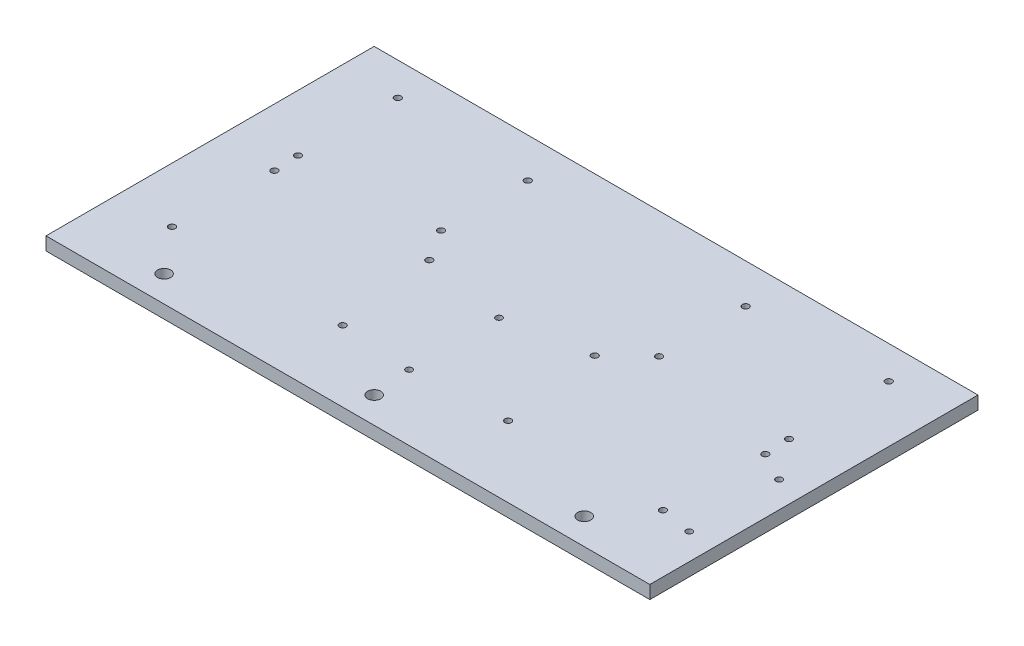
ISO-10303-21;
HEADER;
FILE_DESCRIPTION(('STEP AP214'),'2;1');
FILE_NAME('part.step','',(''),(''),'','','');
FILE_SCHEMA(('AUTOMOTIVE_DESIGN { 1 0 10303 214 1 1 1 1 }'));
ENDSEC;
DATA;
#1=APPLICATION_CONTEXT('core data for automotive mechanical design processes');
#2=APPLICATION_PROTOCOL_DEFINITION('international standard','automotive_design',2000,#1);
#3=PRODUCT_CONTEXT('',#1,'mechanical');
#4=PRODUCT('Part','Part','',(#3));
#5=PRODUCT_RELATED_PRODUCT_CATEGORY('part','',(#4));
#6=PRODUCT_DEFINITION_FORMATION('','',#4);
#7=PRODUCT_DEFINITION_CONTEXT('part definition',#1,'design');
#8=PRODUCT_DEFINITION('design','',#6,#7);
#9=PRODUCT_DEFINITION_SHAPE('','',#8);
#10=(LENGTH_UNIT() NAMED_UNIT(*) SI_UNIT(.MILLI.,.METRE.));
#11=(NAMED_UNIT(*) PLANE_ANGLE_UNIT() SI_UNIT($,.RADIAN.));
#12=(NAMED_UNIT(*) SI_UNIT($,.STERADIAN.) SOLID_ANGLE_UNIT());
#13=UNCERTAINTY_MEASURE_WITH_UNIT(LENGTH_MEASURE(1.E-05),#10,'distance_accuracy_value','');
#14=(GEOMETRIC_REPRESENTATION_CONTEXT(3) GLOBAL_UNCERTAINTY_ASSIGNED_CONTEXT((#13)) GLOBAL_UNIT_ASSIGNED_CONTEXT((#10,
#11,#12)) REPRESENTATION_CONTEXT('',''));
#15=CARTESIAN_POINT('',(0.,0.,0.));
#16=DIRECTION('',(0.,0.,1.));
#17=DIRECTION('',(1.,0.,0.));
#18=AXIS2_PLACEMENT_3D('',#15,#16,#17);
#19=CARTESIAN_POINT('',(0.,6.35,0.));
#20=DIRECTION('',(1.,0.,0.));
#21=DIRECTION('',(0.,0.,-1.));
#22=AXIS2_PLACEMENT_3D('',#19,#20,#21);
#23=PLANE('',#22);
#24=DIRECTION('',(0.,0.,1.));
#25=VECTOR('',#24,1.);
#26=CARTESIAN_POINT('',(0.,0.,0.));
#27=LINE('',#26,#25);
#28=CARTESIAN_POINT('',(0.,0.,-158.75));
#29=VERTEX_POINT('',#28);
#30=CARTESIAN_POINT('',(0.,0.,0.));
#31=VERTEX_POINT('',#30);
#32=EDGE_CURVE('E95',#29,#31,#27,.T.);
#33=ORIENTED_EDGE('',*,*,#32,.T.);
#34=DIRECTION('',(0.,-1.,0.));
#35=VECTOR('',#34,1.);
#36=CARTESIAN_POINT('',(0.,6.35,0.));
#37=LINE('',#36,#35);
#38=CARTESIAN_POINT('',(0.,6.35,0.));
#39=VERTEX_POINT('',#38);
#40=EDGE_CURVE('E11',#39,#31,#37,.T.);
#41=ORIENTED_EDGE('',*,*,#40,.F.);
#42=DIRECTION('',(0.,0.,1.));
#43=VECTOR('',#42,1.);
#44=CARTESIAN_POINT('',(0.,6.35,0.));
#45=LINE('',#44,#43);
#46=CARTESIAN_POINT('',(0.,6.35,-158.75));
#47=VERTEX_POINT('',#46);
#48=EDGE_CURVE('E83',#47,#39,#45,.T.);
#49=ORIENTED_EDGE('',*,*,#48,.F.);
#50=DIRECTION('',(0.,-1.,0.));
#51=VECTOR('',#50,1.);
#52=CARTESIAN_POINT('',(0.,6.35,-158.75));
#53=LINE('',#52,#51);
#54=EDGE_CURVE('E91',#47,#29,#53,.T.);
#55=ORIENTED_EDGE('',*,*,#54,.T.);
#56=EDGE_LOOP('',(#33,#41,#49,#55));
#57=FACE_BOUND('',#56,.T.);
#58=ADVANCED_FACE('F32',(#57),#23,.F.);
#59=CARTESIAN_POINT('',(0.,6.35,0.));
#60=DIRECTION('',(0.,0.,-1.));
#61=DIRECTION('',(-1.,0.,0.));
#62=AXIS2_PLACEMENT_3D('',#59,#60,#61);
#63=PLANE('',#62);
#64=DIRECTION('',(1.,0.,0.));
#65=VECTOR('',#64,1.);
#66=CARTESIAN_POINT('',(0.,0.,0.));
#67=LINE('',#66,#65);
#68=CARTESIAN_POINT('',(292.1,0.,0.));
#69=VERTEX_POINT('',#68);
#70=EDGE_CURVE('E87',#31,#69,#67,.T.);
#71=ORIENTED_EDGE('',*,*,#70,.T.);
#72=DIRECTION('',(0.,-1.,0.));
#73=VECTOR('',#72,1.);
#74=CARTESIAN_POINT('',(292.1,6.35,0.));
#75=LINE('',#74,#73);
#76=CARTESIAN_POINT('',(292.1,6.35,0.));
#77=VERTEX_POINT('',#76);
#78=EDGE_CURVE('E40',#77,#69,#75,.T.);
#79=ORIENTED_EDGE('',*,*,#78,.F.);
#80=DIRECTION('',(1.,0.,0.));
#81=VECTOR('',#80,1.);
#82=CARTESIAN_POINT('',(0.,6.35,0.));
#83=LINE('',#82,#81);
#84=EDGE_CURVE('E78',#39,#77,#83,.T.);
#85=ORIENTED_EDGE('',*,*,#84,.F.);
#86=ORIENTED_EDGE('',*,*,#40,.T.);
#87=EDGE_LOOP('',(#71,#79,#85,#86));
#88=FACE_BOUND('',#87,.T.);
#89=ADVANCED_FACE('F86',(#88),#63,.F.);
#90=CARTESIAN_POINT('',(292.1,6.35,0.));
#91=DIRECTION('',(-1.,0.,0.));
#92=DIRECTION('',(0.,0.,1.));
#93=AXIS2_PLACEMENT_3D('',#90,#91,#92);
#94=PLANE('',#93);
#95=DIRECTION('',(0.,0.,-1.));
#96=VECTOR('',#95,1.);
#97=CARTESIAN_POINT('',(292.1,0.,0.));
#98=LINE('',#97,#96);
#99=CARTESIAN_POINT('',(292.1,0.,-158.75));
#100=VERTEX_POINT('',#99);
#101=EDGE_CURVE('E65',#69,#100,#98,.T.);
#102=ORIENTED_EDGE('',*,*,#101,.T.);
#103=DIRECTION('',(0.,-1.,0.));
#104=VECTOR('',#103,1.);
#105=CARTESIAN_POINT('',(292.1,6.35,-158.75));
#106=LINE('',#105,#104);
#107=CARTESIAN_POINT('',(292.1,6.35,-158.75));
#108=VERTEX_POINT('',#107);
#109=EDGE_CURVE('E88',#108,#100,#106,.T.);
#110=ORIENTED_EDGE('',*,*,#109,.F.);
#111=DIRECTION('',(0.,0.,-1.));
#112=VECTOR('',#111,1.);
#113=CARTESIAN_POINT('',(292.1,6.35,0.));
#114=LINE('',#113,#112);
#115=EDGE_CURVE('E81',#77,#108,#114,.T.);
#116=ORIENTED_EDGE('',*,*,#115,.F.);
#117=ORIENTED_EDGE('',*,*,#78,.T.);
#118=EDGE_LOOP('',(#102,#110,#116,#117));
#119=FACE_BOUND('',#118,.T.);
#120=ADVANCED_FACE('F89',(#119),#94,.F.);
#121=CARTESIAN_POINT('',(0.,6.35,-158.75));
#122=DIRECTION('',(0.,0.,1.));
#123=DIRECTION('',(1.,0.,0.));
#124=AXIS2_PLACEMENT_3D('',#121,#122,#123);
#125=PLANE('',#124);
#126=DIRECTION('',(-1.,0.,0.));
#127=VECTOR('',#126,1.);
#128=CARTESIAN_POINT('',(0.,0.,-158.75));
#129=LINE('',#128,#127);
#130=EDGE_CURVE('E71',#100,#29,#129,.T.);
#131=ORIENTED_EDGE('',*,*,#130,.T.);
#132=ORIENTED_EDGE('',*,*,#54,.F.);
#133=DIRECTION('',(-1.,0.,0.));
#134=VECTOR('',#133,1.);
#135=CARTESIAN_POINT('',(0.,6.35,-158.75));
#136=LINE('',#135,#134);
#137=EDGE_CURVE('E48',#108,#47,#136,.T.);
#138=ORIENTED_EDGE('',*,*,#137,.F.);
#139=ORIENTED_EDGE('',*,*,#109,.T.);
#140=EDGE_LOOP('',(#131,#132,#138,#139));
#141=FACE_BOUND('',#140,.T.);
#142=ADVANCED_FACE('F103',(#141),#125,.F.);
#143=CARTESIAN_POINT('',(0.,6.35,0.));
#144=DIRECTION('',(0.,-1.,0.));
#145=DIRECTION('',(0.,0.,-1.));
#146=AXIS2_PLACEMENT_3D('',#143,#144,#145);
#147=PLANE('',#146);
#148=CARTESIAN_POINT('',(279.4,6.35,-75.25));
#149=DIRECTION('',(0.,1.,0.));
#150=DIRECTION('',(0.,0.,1.));
#151=AXIS2_PLACEMENT_3D('',#148,#149,#150);
#152=CIRCLE('',#151,1.52499999999998);
#153=CARTESIAN_POINT('',(279.4,6.35,-73.725));
#154=VERTEX_POINT('',#153);
#155=EDGE_CURVE('E241',#154,#154,#152,.T.);
#156=ORIENTED_EDGE('',*,*,#155,.F.);
#157=EDGE_LOOP('',(#156));
#158=FACE_BOUND('',#157,.T.);
#159=CARTESIAN_POINT('',(143.9,6.35,-75.25));
#160=DIRECTION('',(0.,1.,0.));
#161=DIRECTION('',(0.,0.,1.));
#162=AXIS2_PLACEMENT_3D('',#159,#160,#161);
#163=CIRCLE('',#162,1.52500000000001);
#164=CARTESIAN_POINT('',(143.9,6.35,-73.725));
#165=VERTEX_POINT('',#164);
#166=EDGE_CURVE('E235',#165,#165,#163,.T.);
#167=ORIENTED_EDGE('',*,*,#166,.F.);
#168=EDGE_LOOP('',(#167));
#169=FACE_BOUND('',#168,.T.);
#170=CARTESIAN_POINT('',(143.9,6.35,-31.75));
#171=DIRECTION('',(0.,1.,0.));
#172=DIRECTION('',(0.,0.,1.));
#173=AXIS2_PLACEMENT_3D('',#170,#171,#172);
#174=CIRCLE('',#173,1.52500000000001);
#175=CARTESIAN_POINT('',(143.9,6.35,-30.225));
#176=VERTEX_POINT('',#175);
#177=EDGE_CURVE('E229',#176,#176,#174,.T.);
#178=ORIENTED_EDGE('',*,*,#177,.F.);
#179=EDGE_LOOP('',(#178));
#180=FACE_BOUND('',#179,.T.);
#181=CARTESIAN_POINT('',(279.4,6.35,-31.75));
#182=DIRECTION('',(0.,1.,0.));
#183=DIRECTION('',(0.,0.,1.));
#184=AXIS2_PLACEMENT_3D('',#181,#182,#183);
#185=CIRCLE('',#184,1.52499999999998);
#186=CARTESIAN_POINT('',(279.4,6.35,-30.225));
#187=VERTEX_POINT('',#186);
#188=EDGE_CURVE('E223',#187,#187,#185,.T.);
#189=ORIENTED_EDGE('',*,*,#188,.F.);
#190=EDGE_LOOP('',(#189));
#191=FACE_BOUND('',#190,.T.);
#192=CARTESIAN_POINT('',(189.23,6.35,-34.29));
#193=DIRECTION('',(0.,1.,0.));
#194=DIRECTION('',(0.,0.,1.));
#195=AXIS2_PLACEMENT_3D('',#192,#193,#194);
#196=CIRCLE('',#195,1.58749999999999);
#197=CARTESIAN_POINT('',(189.23,6.35,-32.7025));
#198=VERTEX_POINT('',#197);
#199=EDGE_CURVE('E218',#198,#198,#196,.T.);
#200=ORIENTED_EDGE('',*,*,#199,.F.);
#201=EDGE_LOOP('',(#200));
#202=FACE_BOUND('',#201,.T.);
#203=CARTESIAN_POINT('',(265.43,6.35,-82.55));
#204=DIRECTION('',(0.,1.,0.));
#205=DIRECTION('',(0.,0.,1.));
#206=AXIS2_PLACEMENT_3D('',#203,#204,#205);
#207=CIRCLE('',#206,1.58750000000004);
#208=CARTESIAN_POINT('',(265.43,6.35,-80.9624999999999));
#209=VERTEX_POINT('',#208);
#210=EDGE_CURVE('E212',#209,#209,#207,.T.);
#211=ORIENTED_EDGE('',*,*,#210,.F.);
#212=EDGE_LOOP('',(#211));
#213=FACE_BOUND('',#212,.T.);
#214=CARTESIAN_POINT('',(264.16,6.35,-34.29));
#215=DIRECTION('',(0.,1.,0.));
#216=DIRECTION('',(0.,0.,1.));
#217=AXIS2_PLACEMENT_3D('',#214,#215,#216);
#218=CIRCLE('',#217,1.58750000000004);
#219=CARTESIAN_POINT('',(264.16,6.35,-32.7025));
#220=VERTEX_POINT('',#219);
#221=EDGE_CURVE('E206',#220,#220,#218,.T.);
#222=ORIENTED_EDGE('',*,*,#221,.F.);
#223=EDGE_LOOP('',(#222));
#224=FACE_BOUND('',#223,.T.);
#225=CARTESIAN_POINT('',(264.795,6.35,-142.875));
#226=DIRECTION('',(0.,1.,0.));
#227=DIRECTION('',(0.,0.,1.));
#228=AXIS2_PLACEMENT_3D('',#225,#226,#227);
#229=CIRCLE('',#228,1.58749999999999);
#230=CARTESIAN_POINT('',(264.795,6.35,-141.2875));
#231=VERTEX_POINT('',#230);
#232=EDGE_CURVE('E200',#231,#231,#229,.T.);
#233=ORIENTED_EDGE('',*,*,#232,.F.);
#234=EDGE_LOOP('',(#233));
#235=FACE_BOUND('',#234,.T.);
#236=CARTESIAN_POINT('',(264.795,6.35,-94.615));
#237=DIRECTION('',(0.,1.,0.));
#238=DIRECTION('',(0.,0.,1.));
#239=AXIS2_PLACEMENT_3D('',#236,#237,#238);
#240=CIRCLE('',#239,1.58749999999998);
#241=CARTESIAN_POINT('',(264.795,6.35,-93.0275));
#242=VERTEX_POINT('',#241);
#243=EDGE_CURVE('E194',#242,#242,#240,.T.);
#244=ORIENTED_EDGE('',*,*,#243,.F.);
#245=EDGE_LOOP('',(#244));
#246=FACE_BOUND('',#245,.T.);
#247=CARTESIAN_POINT('',(198.755,6.35,-97.79));
#248=DIRECTION('',(0.,1.,0.));
#249=DIRECTION('',(0.,0.,1.));
#250=AXIS2_PLACEMENT_3D('',#247,#248,#249);
#251=CIRCLE('',#250,1.58749999999999);
#252=CARTESIAN_POINT('',(198.755,6.35,-96.2025));
#253=VERTEX_POINT('',#252);
#254=EDGE_CURVE('E188',#253,#253,#251,.T.);
#255=ORIENTED_EDGE('',*,*,#254,.F.);
#256=EDGE_LOOP('',(#255));
#257=FACE_BOUND('',#256,.T.);
#258=CARTESIAN_POINT('',(198.755,6.35,-139.7));
#259=DIRECTION('',(0.,1.,0.));
#260=DIRECTION('',(0.,0.,1.));
#261=AXIS2_PLACEMENT_3D('',#258,#259,#260);
#262=CIRCLE('',#261,1.58749999999999);
#263=CARTESIAN_POINT('',(198.755,6.35,-138.1125));
#264=VERTEX_POINT('',#263);
#265=EDGE_CURVE('E182',#264,#264,#262,.T.);
#266=ORIENTED_EDGE('',*,*,#265,.F.);
#267=EDGE_LOOP('',(#266));
#268=FACE_BOUND('',#267,.T.);
#269=CARTESIAN_POINT('',(102.87,6.35,-82.55));
#270=DIRECTION('',(0.,1.,0.));
#271=DIRECTION('',(0.,0.,1.));
#272=AXIS2_PLACEMENT_3D('',#269,#270,#271);
#273=CIRCLE('',#272,1.5875);
#274=CARTESIAN_POINT('',(102.87,6.35,-80.9625));
#275=VERTEX_POINT('',#274);
#276=EDGE_CURVE('E176',#275,#275,#273,.T.);
#277=ORIENTED_EDGE('',*,*,#276,.F.);
#278=EDGE_LOOP('',(#277));
#279=FACE_BOUND('',#278,.T.);
#280=CARTESIAN_POINT('',(109.22,6.35,-34.29));
#281=DIRECTION('',(0.,1.,0.));
#282=DIRECTION('',(0.,0.,1.));
#283=AXIS2_PLACEMENT_3D('',#280,#281,#282);
#284=CIRCLE('',#283,1.58749999999999);
#285=CARTESIAN_POINT('',(109.22,6.35,-32.7025));
#286=VERTEX_POINT('',#285);
#287=EDGE_CURVE('E170',#286,#286,#284,.T.);
#288=ORIENTED_EDGE('',*,*,#287,.F.);
#289=EDGE_LOOP('',(#288));
#290=FACE_BOUND('',#289,.T.);
#291=CARTESIAN_POINT('',(26.67,6.35,-34.29));
#292=DIRECTION('',(0.,1.,0.));
#293=DIRECTION('',(0.,0.,1.));
#294=AXIS2_PLACEMENT_3D('',#291,#292,#293);
#295=CIRCLE('',#294,1.5875);
#296=CARTESIAN_POINT('',(26.67,6.35,-32.7025));
#297=VERTEX_POINT('',#296);
#298=EDGE_CURVE('E164',#297,#297,#295,.T.);
#299=ORIENTED_EDGE('',*,*,#298,.F.);
#300=EDGE_LOOP('',(#299));
#301=FACE_BOUND('',#300,.T.);
#302=CARTESIAN_POINT('',(27.94,6.35,-82.55));
#303=DIRECTION('',(0.,1.,0.));
#304=DIRECTION('',(0.,0.,1.));
#305=AXIS2_PLACEMENT_3D('',#302,#303,#304);
#306=CIRCLE('',#305,1.58750000000001);
#307=CARTESIAN_POINT('',(27.94,6.35,-80.9625));
#308=VERTEX_POINT('',#307);
#309=EDGE_CURVE('E158',#308,#308,#306,.T.);
#310=ORIENTED_EDGE('',*,*,#309,.F.);
#311=EDGE_LOOP('',(#310));
#312=FACE_BOUND('',#311,.T.);
#313=CARTESIAN_POINT('',(93.345,6.35,-139.7));
#314=DIRECTION('',(0.,1.,0.));
#315=DIRECTION('',(0.,0.,1.));
#316=AXIS2_PLACEMENT_3D('',#313,#314,#315);
#317=CIRCLE('',#316,1.5875);
#318=CARTESIAN_POINT('',(93.345,6.35,-138.1125));
#319=VERTEX_POINT('',#318);
#320=EDGE_CURVE('E152',#319,#319,#317,.T.);
#321=ORIENTED_EDGE('',*,*,#320,.F.);
#322=EDGE_LOOP('',(#321));
#323=FACE_BOUND('',#322,.T.);
#324=CARTESIAN_POINT('',(93.345,6.35,-97.79));
#325=DIRECTION('',(0.,1.,0.));
#326=DIRECTION('',(0.,0.,1.));
#327=AXIS2_PLACEMENT_3D('',#324,#325,#326);
#328=CIRCLE('',#327,1.5875);
#329=CARTESIAN_POINT('',(93.345,6.35,-96.2025));
#330=VERTEX_POINT('',#329);
#331=EDGE_CURVE('E146',#330,#330,#328,.T.);
#332=ORIENTED_EDGE('',*,*,#331,.F.);
#333=EDGE_LOOP('',(#332));
#334=FACE_BOUND('',#333,.T.);
#335=CARTESIAN_POINT('',(27.305,6.35,-142.875));
#336=DIRECTION('',(0.,1.,0.));
#337=DIRECTION('',(0.,0.,1.));
#338=AXIS2_PLACEMENT_3D('',#335,#336,#337);
#339=CIRCLE('',#338,1.58749999999999);
#340=CARTESIAN_POINT('',(27.305,6.35,-141.2875));
#341=VERTEX_POINT('',#340);
#342=EDGE_CURVE('E140',#341,#341,#339,.T.);
#343=ORIENTED_EDGE('',*,*,#342,.F.);
#344=EDGE_LOOP('',(#343));
#345=FACE_BOUND('',#344,.T.);
#346=CARTESIAN_POINT('',(27.305,6.35,-94.615));
#347=DIRECTION('',(0.,1.,0.));
#348=DIRECTION('',(0.,0.,1.));
#349=AXIS2_PLACEMENT_3D('',#346,#347,#348);
#350=CIRCLE('',#349,1.58750000000001);
#351=CARTESIAN_POINT('',(27.305,6.35,-93.0275));
#352=VERTEX_POINT('',#351);
#353=EDGE_CURVE('E133',#352,#352,#350,.T.);
#354=ORIENTED_EDGE('',*,*,#353,.F.);
#355=EDGE_LOOP('',(#354));
#356=FACE_BOUND('',#355,.T.);
#357=CARTESIAN_POINT('',(182.88,6.35,-82.55));
#358=DIRECTION('',(0.,1.,0.));
#359=DIRECTION('',(0.,0.,1.));
#360=AXIS2_PLACEMENT_3D('',#357,#358,#359);
#361=CIRCLE('',#360,1.58749999999999);
#362=CARTESIAN_POINT('',(182.88,6.35,-80.9625));
#363=VERTEX_POINT('',#362);
#364=EDGE_CURVE('E127',#363,#363,#361,.T.);
#365=ORIENTED_EDGE('',*,*,#364,.F.);
#366=EDGE_LOOP('',(#365));
#367=FACE_BOUND('',#366,.T.);
#368=CARTESIAN_POINT('',(247.65,6.35,-12.7));
#369=DIRECTION('',(0.,1.,0.));
#370=DIRECTION('',(0.,0.,1.));
#371=AXIS2_PLACEMENT_3D('',#368,#369,#370);
#372=CIRCLE('',#371,3.175);
#373=CARTESIAN_POINT('',(247.65,6.35,-9.525));
#374=VERTEX_POINT('',#373);
#375=EDGE_CURVE('E122',#374,#374,#372,.T.);
#376=ORIENTED_EDGE('',*,*,#375,.F.);
#377=EDGE_LOOP('',(#376));
#378=FACE_BOUND('',#377,.T.);
#379=CARTESIAN_POINT('',(44.45,6.35,-12.7));
#380=DIRECTION('',(0.,1.,0.));
#381=DIRECTION('',(0.,0.,1.));
#382=AXIS2_PLACEMENT_3D('',#379,#380,#381);
#383=CIRCLE('',#382,3.175);
#384=CARTESIAN_POINT('',(44.45,6.35,-9.525));
#385=VERTEX_POINT('',#384);
#386=EDGE_CURVE('E115',#385,#385,#383,.T.);
#387=ORIENTED_EDGE('',*,*,#386,.F.);
#388=EDGE_LOOP('',(#387));
#389=FACE_BOUND('',#388,.T.);
#390=CARTESIAN_POINT('',(146.05,6.35,-12.7));
#391=DIRECTION('',(0.,1.,0.));
#392=DIRECTION('',(0.,0.,1.));
#393=AXIS2_PLACEMENT_3D('',#390,#391,#392);
#394=CIRCLE('',#393,3.175);
#395=CARTESIAN_POINT('',(146.05,6.35,-9.525));
#396=VERTEX_POINT('',#395);
#397=EDGE_CURVE('E109',#396,#396,#394,.T.);
#398=ORIENTED_EDGE('',*,*,#397,.F.);
#399=EDGE_LOOP('',(#398));
#400=FACE_BOUND('',#399,.T.);
#401=ORIENTED_EDGE('',*,*,#48,.T.);
#402=ORIENTED_EDGE('',*,*,#84,.T.);
#403=ORIENTED_EDGE('',*,*,#115,.T.);
#404=ORIENTED_EDGE('',*,*,#137,.T.);
#405=EDGE_LOOP('',(#401,#402,#403,#404));
#406=FACE_BOUND('',#405,.T.);
#407=ADVANCED_FACE('F79',(#158,#169,#180,#191,#202,#213,#224,#235,#246,#257,#268,#279,#290,#301,
#312,#323,#334,#345,#356,#367,#378,#389,#400,#406),#147,.F.);
#408=CARTESIAN_POINT('',(0.,0.,0.));
#409=DIRECTION('',(0.,-1.,0.));
#410=DIRECTION('',(0.,0.,-1.));
#411=AXIS2_PLACEMENT_3D('',#408,#409,#410);
#412=PLANE('',#411);
#413=CARTESIAN_POINT('',(279.4,0.,-75.25));
#414=DIRECTION('',(0.,1.,0.));
#415=DIRECTION('',(0.,0.,1.));
#416=AXIS2_PLACEMENT_3D('',#413,#414,#415);
#417=CIRCLE('',#416,1.52499999999998);
#418=CARTESIAN_POINT('',(279.4,0.,-73.725));
#419=VERTEX_POINT('',#418);
#420=EDGE_CURVE('E226',#419,#419,#417,.T.);
#421=ORIENTED_EDGE('',*,*,#420,.T.);
#422=EDGE_LOOP('',(#421));
#423=FACE_BOUND('',#422,.T.);
#424=CARTESIAN_POINT('',(143.9,0.,-75.25));
#425=DIRECTION('',(0.,1.,0.));
#426=DIRECTION('',(0.,0.,1.));
#427=AXIS2_PLACEMENT_3D('',#424,#425,#426);
#428=CIRCLE('',#427,1.52500000000001);
#429=CARTESIAN_POINT('',(143.9,0.,-73.725));
#430=VERTEX_POINT('',#429);
#431=EDGE_CURVE('E238',#430,#430,#428,.T.);
#432=ORIENTED_EDGE('',*,*,#431,.T.);
#433=EDGE_LOOP('',(#432));
#434=FACE_BOUND('',#433,.T.);
#435=CARTESIAN_POINT('',(143.9,0.,-31.75));
#436=DIRECTION('',(0.,1.,0.));
#437=DIRECTION('',(0.,0.,1.));
#438=AXIS2_PLACEMENT_3D('',#435,#436,#437);
#439=CIRCLE('',#438,1.52500000000001);
#440=CARTESIAN_POINT('',(143.9,0.,-30.225));
#441=VERTEX_POINT('',#440);
#442=EDGE_CURVE('E232',#441,#441,#439,.T.);
#443=ORIENTED_EDGE('',*,*,#442,.T.);
#444=EDGE_LOOP('',(#443));
#445=FACE_BOUND('',#444,.T.);
#446=CARTESIAN_POINT('',(279.4,0.,-31.75));
#447=DIRECTION('',(0.,1.,0.));
#448=DIRECTION('',(0.,0.,1.));
#449=AXIS2_PLACEMENT_3D('',#446,#447,#448);
#450=CIRCLE('',#449,1.52499999999998);
#451=CARTESIAN_POINT('',(279.4,0.,-30.225));
#452=VERTEX_POINT('',#451);
#453=EDGE_CURVE('E137',#452,#452,#450,.T.);
#454=ORIENTED_EDGE('',*,*,#453,.T.);
#455=EDGE_LOOP('',(#454));
#456=FACE_BOUND('',#455,.T.);
#457=CARTESIAN_POINT('',(189.23,0.,-34.29));
#458=DIRECTION('',(0.,1.,0.));
#459=DIRECTION('',(0.,0.,1.));
#460=AXIS2_PLACEMENT_3D('',#457,#458,#459);
#461=CIRCLE('',#460,1.58749999999999);
#462=CARTESIAN_POINT('',(189.23,0.,-32.7025));
#463=VERTEX_POINT('',#462);
#464=EDGE_CURVE('E130',#463,#463,#461,.T.);
#465=ORIENTED_EDGE('',*,*,#464,.T.);
#466=EDGE_LOOP('',(#465));
#467=FACE_BOUND('',#466,.T.);
#468=CARTESIAN_POINT('',(265.43,0.,-82.55));
#469=DIRECTION('',(0.,1.,0.));
#470=DIRECTION('',(0.,0.,1.));
#471=AXIS2_PLACEMENT_3D('',#468,#469,#470);
#472=CIRCLE('',#471,1.58750000000004);
#473=CARTESIAN_POINT('',(265.43,0.,-80.9624999999999));
#474=VERTEX_POINT('',#473);
#475=EDGE_CURVE('E215',#474,#474,#472,.T.);
#476=ORIENTED_EDGE('',*,*,#475,.T.);
#477=EDGE_LOOP('',(#476));
#478=FACE_BOUND('',#477,.T.);
#479=CARTESIAN_POINT('',(264.16,0.,-34.29));
#480=DIRECTION('',(0.,1.,0.));
#481=DIRECTION('',(0.,0.,1.));
#482=AXIS2_PLACEMENT_3D('',#479,#480,#481);
#483=CIRCLE('',#482,1.58750000000004);
#484=CARTESIAN_POINT('',(264.16,0.,-32.7025));
#485=VERTEX_POINT('',#484);
#486=EDGE_CURVE('E209',#485,#485,#483,.T.);
#487=ORIENTED_EDGE('',*,*,#486,.T.);
#488=EDGE_LOOP('',(#487));
#489=FACE_BOUND('',#488,.T.);
#490=CARTESIAN_POINT('',(264.795,0.,-142.875));
#491=DIRECTION('',(0.,1.,0.));
#492=DIRECTION('',(0.,0.,1.));
#493=AXIS2_PLACEMENT_3D('',#490,#491,#492);
#494=CIRCLE('',#493,1.58749999999999);
#495=CARTESIAN_POINT('',(264.795,0.,-141.2875));
#496=VERTEX_POINT('',#495);
#497=EDGE_CURVE('E203',#496,#496,#494,.T.);
#498=ORIENTED_EDGE('',*,*,#497,.T.);
#499=EDGE_LOOP('',(#498));
#500=FACE_BOUND('',#499,.T.);
#501=CARTESIAN_POINT('',(264.795,0.,-94.615));
#502=DIRECTION('',(0.,1.,0.));
#503=DIRECTION('',(0.,0.,1.));
#504=AXIS2_PLACEMENT_3D('',#501,#502,#503);
#505=CIRCLE('',#504,1.58749999999998);
#506=CARTESIAN_POINT('',(264.795,0.,-93.0275));
#507=VERTEX_POINT('',#506);
#508=EDGE_CURVE('E197',#507,#507,#505,.T.);
#509=ORIENTED_EDGE('',*,*,#508,.T.);
#510=EDGE_LOOP('',(#509));
#511=FACE_BOUND('',#510,.T.);
#512=CARTESIAN_POINT('',(198.755,0.,-97.79));
#513=DIRECTION('',(0.,1.,0.));
#514=DIRECTION('',(0.,0.,1.));
#515=AXIS2_PLACEMENT_3D('',#512,#513,#514);
#516=CIRCLE('',#515,1.58749999999999);
#517=CARTESIAN_POINT('',(198.755,0.,-96.2025));
#518=VERTEX_POINT('',#517);
#519=EDGE_CURVE('E191',#518,#518,#516,.T.);
#520=ORIENTED_EDGE('',*,*,#519,.T.);
#521=EDGE_LOOP('',(#520));
#522=FACE_BOUND('',#521,.T.);
#523=CARTESIAN_POINT('',(198.755,0.,-139.7));
#524=DIRECTION('',(0.,1.,0.));
#525=DIRECTION('',(0.,0.,1.));
#526=AXIS2_PLACEMENT_3D('',#523,#524,#525);
#527=CIRCLE('',#526,1.58749999999999);
#528=CARTESIAN_POINT('',(198.755,0.,-138.1125));
#529=VERTEX_POINT('',#528);
#530=EDGE_CURVE('E185',#529,#529,#527,.T.);
#531=ORIENTED_EDGE('',*,*,#530,.T.);
#532=EDGE_LOOP('',(#531));
#533=FACE_BOUND('',#532,.T.);
#534=CARTESIAN_POINT('',(102.87,0.,-82.55));
#535=DIRECTION('',(0.,1.,0.));
#536=DIRECTION('',(0.,0.,1.));
#537=AXIS2_PLACEMENT_3D('',#534,#535,#536);
#538=CIRCLE('',#537,1.5875);
#539=CARTESIAN_POINT('',(102.87,0.,-80.9625));
#540=VERTEX_POINT('',#539);
#541=EDGE_CURVE('E179',#540,#540,#538,.T.);
#542=ORIENTED_EDGE('',*,*,#541,.T.);
#543=EDGE_LOOP('',(#542));
#544=FACE_BOUND('',#543,.T.);
#545=CARTESIAN_POINT('',(109.22,0.,-34.29));
#546=DIRECTION('',(0.,1.,0.));
#547=DIRECTION('',(0.,0.,1.));
#548=AXIS2_PLACEMENT_3D('',#545,#546,#547);
#549=CIRCLE('',#548,1.58749999999999);
#550=CARTESIAN_POINT('',(109.22,0.,-32.7025));
#551=VERTEX_POINT('',#550);
#552=EDGE_CURVE('E173',#551,#551,#549,.T.);
#553=ORIENTED_EDGE('',*,*,#552,.T.);
#554=EDGE_LOOP('',(#553));
#555=FACE_BOUND('',#554,.T.);
#556=CARTESIAN_POINT('',(26.67,0.,-34.29));
#557=DIRECTION('',(0.,1.,0.));
#558=DIRECTION('',(0.,0.,1.));
#559=AXIS2_PLACEMENT_3D('',#556,#557,#558);
#560=CIRCLE('',#559,1.5875);
#561=CARTESIAN_POINT('',(26.67,0.,-32.7025));
#562=VERTEX_POINT('',#561);
#563=EDGE_CURVE('E167',#562,#562,#560,.T.);
#564=ORIENTED_EDGE('',*,*,#563,.T.);
#565=EDGE_LOOP('',(#564));
#566=FACE_BOUND('',#565,.T.);
#567=CARTESIAN_POINT('',(27.94,0.,-82.55));
#568=DIRECTION('',(0.,1.,0.));
#569=DIRECTION('',(0.,0.,1.));
#570=AXIS2_PLACEMENT_3D('',#567,#568,#569);
#571=CIRCLE('',#570,1.58750000000001);
#572=CARTESIAN_POINT('',(27.94,0.,-80.9625));
#573=VERTEX_POINT('',#572);
#574=EDGE_CURVE('E161',#573,#573,#571,.T.);
#575=ORIENTED_EDGE('',*,*,#574,.T.);
#576=EDGE_LOOP('',(#575));
#577=FACE_BOUND('',#576,.T.);
#578=CARTESIAN_POINT('',(93.345,0.,-139.7));
#579=DIRECTION('',(0.,1.,0.));
#580=DIRECTION('',(0.,0.,1.));
#581=AXIS2_PLACEMENT_3D('',#578,#579,#580);
#582=CIRCLE('',#581,1.5875);
#583=CARTESIAN_POINT('',(93.345,0.,-138.1125));
#584=VERTEX_POINT('',#583);
#585=EDGE_CURVE('E155',#584,#584,#582,.T.);
#586=ORIENTED_EDGE('',*,*,#585,.T.);
#587=EDGE_LOOP('',(#586));
#588=FACE_BOUND('',#587,.T.);
#589=CARTESIAN_POINT('',(93.345,0.,-97.79));
#590=DIRECTION('',(0.,1.,0.));
#591=DIRECTION('',(0.,0.,1.));
#592=AXIS2_PLACEMENT_3D('',#589,#590,#591);
#593=CIRCLE('',#592,1.5875);
#594=CARTESIAN_POINT('',(93.345,0.,-96.2025));
#595=VERTEX_POINT('',#594);
#596=EDGE_CURVE('E149',#595,#595,#593,.T.);
#597=ORIENTED_EDGE('',*,*,#596,.T.);
#598=EDGE_LOOP('',(#597));
#599=FACE_BOUND('',#598,.T.);
#600=CARTESIAN_POINT('',(27.305,0.,-142.875));
#601=DIRECTION('',(0.,1.,0.));
#602=DIRECTION('',(0.,0.,1.));
#603=AXIS2_PLACEMENT_3D('',#600,#601,#602);
#604=CIRCLE('',#603,1.58749999999999);
#605=CARTESIAN_POINT('',(27.305,0.,-141.2875));
#606=VERTEX_POINT('',#605);
#607=EDGE_CURVE('E143',#606,#606,#604,.T.);
#608=ORIENTED_EDGE('',*,*,#607,.T.);
#609=EDGE_LOOP('',(#608));
#610=FACE_BOUND('',#609,.T.);
#611=CARTESIAN_POINT('',(27.305,0.,-94.615));
#612=DIRECTION('',(0.,1.,0.));
#613=DIRECTION('',(0.,0.,1.));
#614=AXIS2_PLACEMENT_3D('',#611,#612,#613);
#615=CIRCLE('',#614,1.58750000000001);
#616=CARTESIAN_POINT('',(27.305,0.,-93.0275));
#617=VERTEX_POINT('',#616);
#618=EDGE_CURVE('E136',#617,#617,#615,.T.);
#619=ORIENTED_EDGE('',*,*,#618,.T.);
#620=EDGE_LOOP('',(#619));
#621=FACE_BOUND('',#620,.T.);
#622=CARTESIAN_POINT('',(182.88,0.,-82.55));
#623=DIRECTION('',(0.,1.,0.));
#624=DIRECTION('',(0.,0.,1.));
#625=AXIS2_PLACEMENT_3D('',#622,#623,#624);
#626=CIRCLE('',#625,1.58749999999999);
#627=CARTESIAN_POINT('',(182.88,0.,-80.9625));
#628=VERTEX_POINT('',#627);
#629=EDGE_CURVE('E119',#628,#628,#626,.T.);
#630=ORIENTED_EDGE('',*,*,#629,.T.);
#631=EDGE_LOOP('',(#630));
#632=FACE_BOUND('',#631,.T.);
#633=CARTESIAN_POINT('',(247.65,0.,-12.7));
#634=DIRECTION('',(0.,1.,0.));
#635=DIRECTION('',(0.,0.,1.));
#636=AXIS2_PLACEMENT_3D('',#633,#634,#635);
#637=CIRCLE('',#636,3.175);
#638=CARTESIAN_POINT('',(247.65,0.,-9.525));
#639=VERTEX_POINT('',#638);
#640=EDGE_CURVE('E112',#639,#639,#637,.T.);
#641=ORIENTED_EDGE('',*,*,#640,.T.);
#642=EDGE_LOOP('',(#641));
#643=FACE_BOUND('',#642,.T.);
#644=CARTESIAN_POINT('',(44.45,0.,-12.7));
#645=DIRECTION('',(0.,1.,0.));
#646=DIRECTION('',(0.,0.,1.));
#647=AXIS2_PLACEMENT_3D('',#644,#645,#646);
#648=CIRCLE('',#647,3.175);
#649=CARTESIAN_POINT('',(44.45,0.,-9.525));
#650=VERTEX_POINT('',#649);
#651=EDGE_CURVE('E118',#650,#650,#648,.T.);
#652=ORIENTED_EDGE('',*,*,#651,.T.);
#653=EDGE_LOOP('',(#652));
#654=FACE_BOUND('',#653,.T.);
#655=CARTESIAN_POINT('',(146.05,0.,-12.7));
#656=DIRECTION('',(0.,1.,0.));
#657=DIRECTION('',(0.,0.,1.));
#658=AXIS2_PLACEMENT_3D('',#655,#656,#657);
#659=CIRCLE('',#658,3.175);
#660=CARTESIAN_POINT('',(146.05,0.,-9.525));
#661=VERTEX_POINT('',#660);
#662=EDGE_CURVE('E98',#661,#661,#659,.T.);
#663=ORIENTED_EDGE('',*,*,#662,.T.);
#664=EDGE_LOOP('',(#663));
#665=FACE_BOUND('',#664,.T.);
#666=ORIENTED_EDGE('',*,*,#32,.F.);
#667=ORIENTED_EDGE('',*,*,#130,.F.);
#668=ORIENTED_EDGE('',*,*,#101,.F.);
#669=ORIENTED_EDGE('',*,*,#70,.F.);
#670=EDGE_LOOP('',(#666,#667,#668,#669));
#671=FACE_BOUND('',#670,.T.);
#672=ADVANCED_FACE('F106',(#423,#434,#445,#456,#467,#478,#489,#500,#511,#522,#533,#544,#555,
#566,#577,#588,#599,#610,#621,#632,#643,#654,#665,#671),#412,.T.);
#673=CARTESIAN_POINT('',(146.05,0.,-12.7));
#674=DIRECTION('',(0.,1.,0.));
#675=DIRECTION('',(0.,0.,1.));
#676=AXIS2_PLACEMENT_3D('',#673,#674,#675);
#677=CYLINDRICAL_SURFACE('',#676,3.175);
#678=ORIENTED_EDGE('',*,*,#662,.F.);
#679=EDGE_LOOP('',(#678));
#680=FACE_BOUND('',#679,.T.);
#681=ORIENTED_EDGE('',*,*,#397,.T.);
#682=EDGE_LOOP('',(#681));
#683=FACE_BOUND('',#682,.T.);
#684=ADVANCED_FACE('F303',(#680,#683),#677,.F.);
#685=CARTESIAN_POINT('',(44.45,0.,-12.7));
#686=DIRECTION('',(0.,1.,0.));
#687=DIRECTION('',(0.,0.,1.));
#688=AXIS2_PLACEMENT_3D('',#685,#686,#687);
#689=CYLINDRICAL_SURFACE('',#688,3.175);
#690=ORIENTED_EDGE('',*,*,#651,.F.);
#691=EDGE_LOOP('',(#690));
#692=FACE_BOUND('',#691,.T.);
#693=ORIENTED_EDGE('',*,*,#386,.T.);
#694=EDGE_LOOP('',(#693));
#695=FACE_BOUND('',#694,.T.);
#696=ADVANCED_FACE('F305',(#692,#695),#689,.F.);
#697=CARTESIAN_POINT('',(247.65,0.,-12.7));
#698=DIRECTION('',(0.,1.,0.));
#699=DIRECTION('',(0.,0.,1.));
#700=AXIS2_PLACEMENT_3D('',#697,#698,#699);
#701=CYLINDRICAL_SURFACE('',#700,3.175);
#702=ORIENTED_EDGE('',*,*,#640,.F.);
#703=EDGE_LOOP('',(#702));
#704=FACE_BOUND('',#703,.T.);
#705=ORIENTED_EDGE('',*,*,#375,.T.);
#706=EDGE_LOOP('',(#705));
#707=FACE_BOUND('',#706,.T.);
#708=ADVANCED_FACE('F312',(#704,#707),#701,.F.);
#709=CARTESIAN_POINT('',(182.88,0.,-82.55));
#710=DIRECTION('',(0.,1.,0.));
#711=DIRECTION('',(0.,0.,1.));
#712=AXIS2_PLACEMENT_3D('',#709,#710,#711);
#713=CYLINDRICAL_SURFACE('',#712,1.58749999999999);
#714=ORIENTED_EDGE('',*,*,#629,.F.);
#715=EDGE_LOOP('',(#714));
#716=FACE_BOUND('',#715,.T.);
#717=ORIENTED_EDGE('',*,*,#364,.T.);
#718=EDGE_LOOP('',(#717));
#719=FACE_BOUND('',#718,.T.);
#720=ADVANCED_FACE('F443',(#716,#719),#713,.F.);
#721=CARTESIAN_POINT('',(27.305,0.,-94.615));
#722=DIRECTION('',(0.,1.,0.));
#723=DIRECTION('',(0.,0.,1.));
#724=AXIS2_PLACEMENT_3D('',#721,#722,#723);
#725=CYLINDRICAL_SURFACE('',#724,1.58750000000001);
#726=ORIENTED_EDGE('',*,*,#618,.F.);
#727=EDGE_LOOP('',(#726));
#728=FACE_BOUND('',#727,.T.);
#729=ORIENTED_EDGE('',*,*,#353,.T.);
#730=EDGE_LOOP('',(#729));
#731=FACE_BOUND('',#730,.T.);
#732=ADVANCED_FACE('F439',(#728,#731),#725,.F.);
#733=CARTESIAN_POINT('',(27.305,0.,-142.875));
#734=DIRECTION('',(0.,1.,0.));
#735=DIRECTION('',(0.,0.,1.));
#736=AXIS2_PLACEMENT_3D('',#733,#734,#735);
#737=CYLINDRICAL_SURFACE('',#736,1.58749999999999);
#738=ORIENTED_EDGE('',*,*,#607,.F.);
#739=EDGE_LOOP('',(#738));
#740=FACE_BOUND('',#739,.T.);
#741=ORIENTED_EDGE('',*,*,#342,.T.);
#742=EDGE_LOOP('',(#741));
#743=FACE_BOUND('',#742,.T.);
#744=ADVANCED_FACE('F435',(#740,#743),#737,.F.);
#745=CARTESIAN_POINT('',(93.345,0.,-97.79));
#746=DIRECTION('',(0.,1.,0.));
#747=DIRECTION('',(0.,0.,1.));
#748=AXIS2_PLACEMENT_3D('',#745,#746,#747);
#749=CYLINDRICAL_SURFACE('',#748,1.5875);
#750=ORIENTED_EDGE('',*,*,#596,.F.);
#751=EDGE_LOOP('',(#750));
#752=FACE_BOUND('',#751,.T.);
#753=ORIENTED_EDGE('',*,*,#331,.T.);
#754=EDGE_LOOP('',(#753));
#755=FACE_BOUND('',#754,.T.);
#756=ADVANCED_FACE('F431',(#752,#755),#749,.F.);
#757=CARTESIAN_POINT('',(93.345,0.,-139.7));
#758=DIRECTION('',(0.,1.,0.));
#759=DIRECTION('',(0.,0.,1.));
#760=AXIS2_PLACEMENT_3D('',#757,#758,#759);
#761=CYLINDRICAL_SURFACE('',#760,1.5875);
#762=ORIENTED_EDGE('',*,*,#585,.F.);
#763=EDGE_LOOP('',(#762));
#764=FACE_BOUND('',#763,.T.);
#765=ORIENTED_EDGE('',*,*,#320,.T.);
#766=EDGE_LOOP('',(#765));
#767=FACE_BOUND('',#766,.T.);
#768=ADVANCED_FACE('F427',(#764,#767),#761,.F.);
#769=CARTESIAN_POINT('',(27.94,0.,-82.55));
#770=DIRECTION('',(0.,1.,0.));
#771=DIRECTION('',(0.,0.,1.));
#772=AXIS2_PLACEMENT_3D('',#769,#770,#771);
#773=CYLINDRICAL_SURFACE('',#772,1.58750000000001);
#774=ORIENTED_EDGE('',*,*,#574,.F.);
#775=EDGE_LOOP('',(#774));
#776=FACE_BOUND('',#775,.T.);
#777=ORIENTED_EDGE('',*,*,#309,.T.);
#778=EDGE_LOOP('',(#777));
#779=FACE_BOUND('',#778,.T.);
#780=ADVANCED_FACE('F423',(#776,#779),#773,.F.);
#781=CARTESIAN_POINT('',(26.67,0.,-34.29));
#782=DIRECTION('',(0.,1.,0.));
#783=DIRECTION('',(0.,0.,1.));
#784=AXIS2_PLACEMENT_3D('',#781,#782,#783);
#785=CYLINDRICAL_SURFACE('',#784,1.5875);
#786=ORIENTED_EDGE('',*,*,#563,.F.);
#787=EDGE_LOOP('',(#786));
#788=FACE_BOUND('',#787,.T.);
#789=ORIENTED_EDGE('',*,*,#298,.T.);
#790=EDGE_LOOP('',(#789));
#791=FACE_BOUND('',#790,.T.);
#792=ADVANCED_FACE('F419',(#788,#791),#785,.F.);
#793=CARTESIAN_POINT('',(109.22,0.,-34.29));
#794=DIRECTION('',(0.,1.,0.));
#795=DIRECTION('',(0.,0.,1.));
#796=AXIS2_PLACEMENT_3D('',#793,#794,#795);
#797=CYLINDRICAL_SURFACE('',#796,1.58749999999999);
#798=ORIENTED_EDGE('',*,*,#552,.F.);
#799=EDGE_LOOP('',(#798));
#800=FACE_BOUND('',#799,.T.);
#801=ORIENTED_EDGE('',*,*,#287,.T.);
#802=EDGE_LOOP('',(#801));
#803=FACE_BOUND('',#802,.T.);
#804=ADVANCED_FACE('F415',(#800,#803),#797,.F.);
#805=CARTESIAN_POINT('',(102.87,0.,-82.55));
#806=DIRECTION('',(0.,1.,0.));
#807=DIRECTION('',(0.,0.,1.));
#808=AXIS2_PLACEMENT_3D('',#805,#806,#807);
#809=CYLINDRICAL_SURFACE('',#808,1.5875);
#810=ORIENTED_EDGE('',*,*,#541,.F.);
#811=EDGE_LOOP('',(#810));
#812=FACE_BOUND('',#811,.T.);
#813=ORIENTED_EDGE('',*,*,#276,.T.);
#814=EDGE_LOOP('',(#813));
#815=FACE_BOUND('',#814,.T.);
#816=ADVANCED_FACE('F411',(#812,#815),#809,.F.);
#817=CARTESIAN_POINT('',(198.755,0.,-139.7));
#818=DIRECTION('',(0.,1.,0.));
#819=DIRECTION('',(0.,0.,1.));
#820=AXIS2_PLACEMENT_3D('',#817,#818,#819);
#821=CYLINDRICAL_SURFACE('',#820,1.58749999999999);
#822=ORIENTED_EDGE('',*,*,#530,.F.);
#823=EDGE_LOOP('',(#822));
#824=FACE_BOUND('',#823,.T.);
#825=ORIENTED_EDGE('',*,*,#265,.T.);
#826=EDGE_LOOP('',(#825));
#827=FACE_BOUND('',#826,.T.);
#828=ADVANCED_FACE('F407',(#824,#827),#821,.F.);
#829=CARTESIAN_POINT('',(198.755,0.,-97.79));
#830=DIRECTION('',(0.,1.,0.));
#831=DIRECTION('',(0.,0.,1.));
#832=AXIS2_PLACEMENT_3D('',#829,#830,#831);
#833=CYLINDRICAL_SURFACE('',#832,1.58749999999999);
#834=ORIENTED_EDGE('',*,*,#519,.F.);
#835=EDGE_LOOP('',(#834));
#836=FACE_BOUND('',#835,.T.);
#837=ORIENTED_EDGE('',*,*,#254,.T.);
#838=EDGE_LOOP('',(#837));
#839=FACE_BOUND('',#838,.T.);
#840=ADVANCED_FACE('F403',(#836,#839),#833,.F.);
#841=CARTESIAN_POINT('',(264.795,0.,-94.615));
#842=DIRECTION('',(0.,1.,0.));
#843=DIRECTION('',(0.,0.,1.));
#844=AXIS2_PLACEMENT_3D('',#841,#842,#843);
#845=CYLINDRICAL_SURFACE('',#844,1.58749999999998);
#846=ORIENTED_EDGE('',*,*,#508,.F.);
#847=EDGE_LOOP('',(#846));
#848=FACE_BOUND('',#847,.T.);
#849=ORIENTED_EDGE('',*,*,#243,.T.);
#850=EDGE_LOOP('',(#849));
#851=FACE_BOUND('',#850,.T.);
#852=ADVANCED_FACE('F399',(#848,#851),#845,.F.);
#853=CARTESIAN_POINT('',(264.795,0.,-142.875));
#854=DIRECTION('',(0.,1.,0.));
#855=DIRECTION('',(0.,0.,1.));
#856=AXIS2_PLACEMENT_3D('',#853,#854,#855);
#857=CYLINDRICAL_SURFACE('',#856,1.58749999999999);
#858=ORIENTED_EDGE('',*,*,#497,.F.);
#859=EDGE_LOOP('',(#858));
#860=FACE_BOUND('',#859,.T.);
#861=ORIENTED_EDGE('',*,*,#232,.T.);
#862=EDGE_LOOP('',(#861));
#863=FACE_BOUND('',#862,.T.);
#864=ADVANCED_FACE('F395',(#860,#863),#857,.F.);
#865=CARTESIAN_POINT('',(264.16,0.,-34.29));
#866=DIRECTION('',(0.,1.,0.));
#867=DIRECTION('',(0.,0.,1.));
#868=AXIS2_PLACEMENT_3D('',#865,#866,#867);
#869=CYLINDRICAL_SURFACE('',#868,1.58750000000004);
#870=ORIENTED_EDGE('',*,*,#486,.F.);
#871=EDGE_LOOP('',(#870));
#872=FACE_BOUND('',#871,.T.);
#873=ORIENTED_EDGE('',*,*,#221,.T.);
#874=EDGE_LOOP('',(#873));
#875=FACE_BOUND('',#874,.T.);
#876=ADVANCED_FACE('F391',(#872,#875),#869,.F.);
#877=CARTESIAN_POINT('',(265.43,0.,-82.55));
#878=DIRECTION('',(0.,1.,0.));
#879=DIRECTION('',(0.,0.,1.));
#880=AXIS2_PLACEMENT_3D('',#877,#878,#879);
#881=CYLINDRICAL_SURFACE('',#880,1.58750000000004);
#882=ORIENTED_EDGE('',*,*,#475,.F.);
#883=EDGE_LOOP('',(#882));
#884=FACE_BOUND('',#883,.T.);
#885=ORIENTED_EDGE('',*,*,#210,.T.);
#886=EDGE_LOOP('',(#885));
#887=FACE_BOUND('',#886,.T.);
#888=ADVANCED_FACE('F387',(#884,#887),#881,.F.);
#889=CARTESIAN_POINT('',(189.23,0.,-34.29));
#890=DIRECTION('',(0.,1.,0.));
#891=DIRECTION('',(0.,0.,1.));
#892=AXIS2_PLACEMENT_3D('',#889,#890,#891);
#893=CYLINDRICAL_SURFACE('',#892,1.58749999999999);
#894=ORIENTED_EDGE('',*,*,#464,.F.);
#895=EDGE_LOOP('',(#894));
#896=FACE_BOUND('',#895,.T.);
#897=ORIENTED_EDGE('',*,*,#199,.T.);
#898=EDGE_LOOP('',(#897));
#899=FACE_BOUND('',#898,.T.);
#900=ADVANCED_FACE('F352',(#896,#899),#893,.F.);
#901=CARTESIAN_POINT('',(279.4,0.,-31.75));
#902=DIRECTION('',(0.,1.,0.));
#903=DIRECTION('',(0.,0.,1.));
#904=AXIS2_PLACEMENT_3D('',#901,#902,#903);
#905=CYLINDRICAL_SURFACE('',#904,1.52499999999998);
#906=ORIENTED_EDGE('',*,*,#453,.F.);
#907=EDGE_LOOP('',(#906));
#908=FACE_BOUND('',#907,.T.);
#909=ORIENTED_EDGE('',*,*,#188,.T.);
#910=EDGE_LOOP('',(#909));
#911=FACE_BOUND('',#910,.T.);
#912=ADVANCED_FACE('F346',(#908,#911),#905,.F.);
#913=CARTESIAN_POINT('',(143.9,0.,-31.75));
#914=DIRECTION('',(0.,1.,0.));
#915=DIRECTION('',(0.,0.,1.));
#916=AXIS2_PLACEMENT_3D('',#913,#914,#915);
#917=CYLINDRICAL_SURFACE('',#916,1.52500000000001);
#918=ORIENTED_EDGE('',*,*,#442,.F.);
#919=EDGE_LOOP('',(#918));
#920=FACE_BOUND('',#919,.T.);
#921=ORIENTED_EDGE('',*,*,#177,.T.);
#922=EDGE_LOOP('',(#921));
#923=FACE_BOUND('',#922,.T.);
#924=ADVANCED_FACE('F351',(#920,#923),#917,.F.);
#925=CARTESIAN_POINT('',(143.9,0.,-75.25));
#926=DIRECTION('',(0.,1.,0.));
#927=DIRECTION('',(0.,0.,1.));
#928=AXIS2_PLACEMENT_3D('',#925,#926,#927);
#929=CYLINDRICAL_SURFACE('',#928,1.52500000000001);
#930=ORIENTED_EDGE('',*,*,#431,.F.);
#931=EDGE_LOOP('',(#930));
#932=FACE_BOUND('',#931,.T.);
#933=ORIENTED_EDGE('',*,*,#166,.T.);
#934=EDGE_LOOP('',(#933));
#935=FACE_BOUND('',#934,.T.);
#936=ADVANCED_FACE('F252',(#932,#935),#929,.F.);
#937=CARTESIAN_POINT('',(279.4,0.,-75.25));
#938=DIRECTION('',(0.,1.,0.));
#939=DIRECTION('',(0.,0.,1.));
#940=AXIS2_PLACEMENT_3D('',#937,#938,#939);
#941=CYLINDRICAL_SURFACE('',#940,1.52499999999998);
#942=ORIENTED_EDGE('',*,*,#420,.F.);
#943=EDGE_LOOP('',(#942));
#944=FACE_BOUND('',#943,.T.);
#945=ORIENTED_EDGE('',*,*,#155,.T.);
#946=EDGE_LOOP('',(#945));
#947=FACE_BOUND('',#946,.T.);
#948=ADVANCED_FACE('F249',(#944,#947),#941,.F.);
#949=CLOSED_SHELL('',(#58,#89,#120,#142,#407,#672,#684,#696,#708,#720,#732,#744,#756,#768,#780,
#792,#804,#816,#828,#840,#852,#864,#876,#888,#900,#912,#924,#936,#948));
#950=MANIFOLD_SOLID_BREP('B2',#949);
#951=ADVANCED_BREP_SHAPE_REPRESENTATION('',(#18,#950),#14);
#952=SHAPE_DEFINITION_REPRESENTATION(#9,#951);
ENDSEC;
END-ISO-10303-21;
